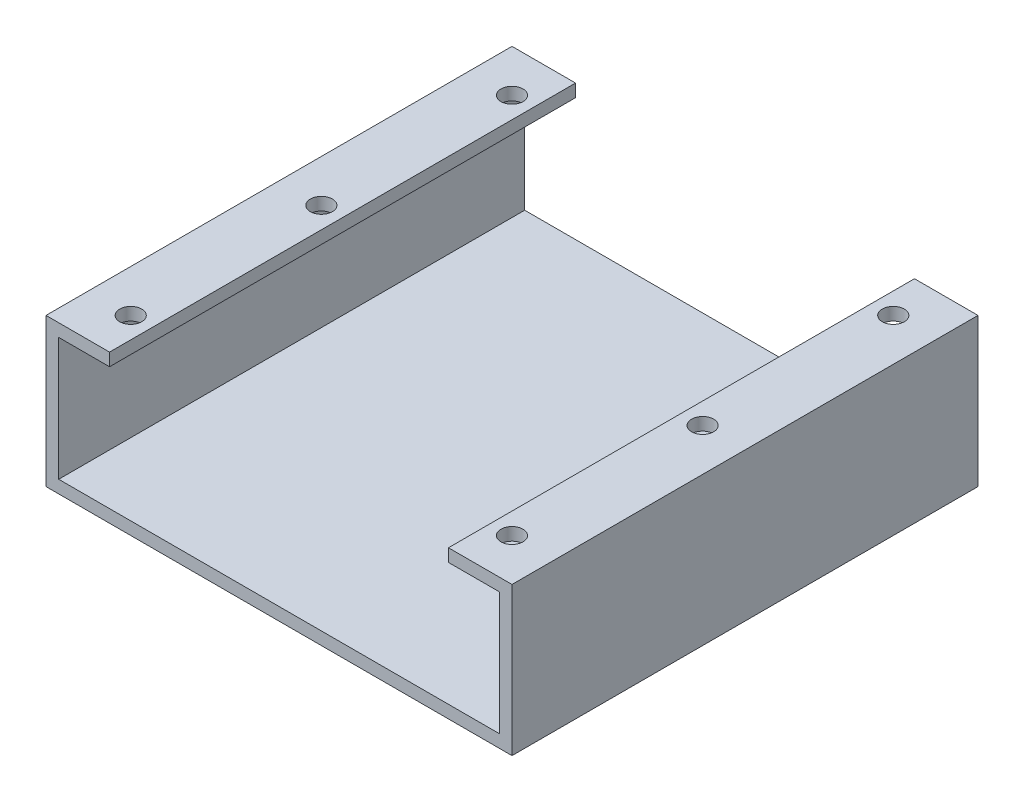
ISO-10303-21;
HEADER;
FILE_DESCRIPTION(('STEP AP214'),'2;1');
FILE_NAME('part.step','',(''),(''),'','','');
FILE_SCHEMA(('AUTOMOTIVE_DESIGN { 1 0 10303 214 1 1 1 1 }'));
ENDSEC;
DATA;
#1=APPLICATION_CONTEXT('core data for automotive mechanical design processes');
#2=APPLICATION_PROTOCOL_DEFINITION('international standard','automotive_design',2000,#1);
#3=PRODUCT_CONTEXT('',#1,'mechanical');
#4=PRODUCT('Part','Part','',(#3));
#5=PRODUCT_RELATED_PRODUCT_CATEGORY('part','',(#4));
#6=PRODUCT_DEFINITION_FORMATION('','',#4);
#7=PRODUCT_DEFINITION_CONTEXT('part definition',#1,'design');
#8=PRODUCT_DEFINITION('design','',#6,#7);
#9=PRODUCT_DEFINITION_SHAPE('','',#8);
#10=(LENGTH_UNIT() NAMED_UNIT(*) SI_UNIT(.MILLI.,.METRE.));
#11=(NAMED_UNIT(*) PLANE_ANGLE_UNIT() SI_UNIT($,.RADIAN.));
#12=(NAMED_UNIT(*) SI_UNIT($,.STERADIAN.) SOLID_ANGLE_UNIT());
#13=UNCERTAINTY_MEASURE_WITH_UNIT(LENGTH_MEASURE(1.E-05),#10,'distance_accuracy_value','');
#14=(GEOMETRIC_REPRESENTATION_CONTEXT(3) GLOBAL_UNCERTAINTY_ASSIGNED_CONTEXT((#13)) GLOBAL_UNIT_ASSIGNED_CONTEXT((#10,
#11,#12)) REPRESENTATION_CONTEXT('',''));
#15=CARTESIAN_POINT('',(0.,0.,0.));
#16=DIRECTION('',(0.,0.,1.));
#17=DIRECTION('',(1.,0.,0.));
#18=AXIS2_PLACEMENT_3D('',#15,#16,#17);
#19=CARTESIAN_POINT('',(0.,0.,110.));
#20=DIRECTION('',(1.,0.,0.));
#21=DIRECTION('',(0.,0.,-1.));
#22=AXIS2_PLACEMENT_3D('',#19,#20,#21);
#23=PLANE('',#22);
#24=DIRECTION('',(0.,-1.,0.));
#25=VECTOR('',#24,1.);
#26=CARTESIAN_POINT('',(0.,0.,0.));
#27=LINE('',#26,#25);
#28=CARTESIAN_POINT('',(0.,35.,0.));
#29=VERTEX_POINT('',#28);
#30=CARTESIAN_POINT('',(0.,0.,0.));
#31=VERTEX_POINT('',#30);
#32=EDGE_CURVE('E155',#29,#31,#27,.T.);
#33=ORIENTED_EDGE('',*,*,#32,.T.);
#34=DIRECTION('',(0.,0.,-1.));
#35=VECTOR('',#34,1.);
#36=CARTESIAN_POINT('',(0.,0.,110.));
#37=LINE('',#36,#35);
#38=CARTESIAN_POINT('',(0.,0.,110.));
#39=VERTEX_POINT('',#38);
#40=EDGE_CURVE('E11',#39,#31,#37,.T.);
#41=ORIENTED_EDGE('',*,*,#40,.F.);
#42=DIRECTION('',(0.,-1.,0.));
#43=VECTOR('',#42,1.);
#44=CARTESIAN_POINT('',(0.,0.,110.));
#45=LINE('',#44,#43);
#46=CARTESIAN_POINT('',(0.,35.,110.));
#47=VERTEX_POINT('',#46);
#48=EDGE_CURVE('E178',#47,#39,#45,.T.);
#49=ORIENTED_EDGE('',*,*,#48,.F.);
#50=DIRECTION('',(0.,0.,-1.));
#51=VECTOR('',#50,1.);
#52=CARTESIAN_POINT('',(0.,35.,110.));
#53=LINE('',#52,#51);
#54=EDGE_CURVE('E151',#47,#29,#53,.T.);
#55=ORIENTED_EDGE('',*,*,#54,.T.);
#56=EDGE_LOOP('',(#33,#41,#49,#55));
#57=FACE_BOUND('',#56,.T.);
#58=ADVANCED_FACE('F35',(#57),#23,.F.);
#59=CARTESIAN_POINT('',(0.,0.,110.));
#60=DIRECTION('',(0.,1.,0.));
#61=DIRECTION('',(0.,0.,1.));
#62=AXIS2_PLACEMENT_3D('',#59,#60,#61);
#63=PLANE('',#62);
#64=DIRECTION('',(1.,0.,0.));
#65=VECTOR('',#64,1.);
#66=CARTESIAN_POINT('',(0.,0.,0.));
#67=LINE('',#66,#65);
#68=CARTESIAN_POINT('',(110.,0.,0.));
#69=VERTEX_POINT('',#68);
#70=EDGE_CURVE('E158',#31,#69,#67,.T.);
#71=ORIENTED_EDGE('',*,*,#70,.T.);
#72=DIRECTION('',(0.,0.,-1.));
#73=VECTOR('',#72,1.);
#74=CARTESIAN_POINT('',(110.,0.,110.));
#75=LINE('',#74,#73);
#76=CARTESIAN_POINT('',(110.,0.,110.));
#77=VERTEX_POINT('',#76);
#78=EDGE_CURVE('E43',#77,#69,#75,.T.);
#79=ORIENTED_EDGE('',*,*,#78,.F.);
#80=DIRECTION('',(1.,0.,0.));
#81=VECTOR('',#80,1.);
#82=CARTESIAN_POINT('',(0.,0.,110.));
#83=LINE('',#82,#81);
#84=EDGE_CURVE('E106',#39,#77,#83,.T.);
#85=ORIENTED_EDGE('',*,*,#84,.F.);
#86=ORIENTED_EDGE('',*,*,#40,.T.);
#87=EDGE_LOOP('',(#71,#79,#85,#86));
#88=FACE_BOUND('',#87,.T.);
#89=ADVANCED_FACE('F259',(#88),#63,.F.);
#90=CARTESIAN_POINT('',(110.,0.,110.));
#91=DIRECTION('',(-1.,0.,0.));
#92=DIRECTION('',(0.,0.,1.));
#93=AXIS2_PLACEMENT_3D('',#90,#91,#92);
#94=PLANE('',#93);
#95=DIRECTION('',(0.,1.,0.));
#96=VECTOR('',#95,1.);
#97=CARTESIAN_POINT('',(110.,0.,0.));
#98=LINE('',#97,#96);
#99=CARTESIAN_POINT('',(110.,35.,0.));
#100=VERTEX_POINT('',#99);
#101=EDGE_CURVE('E161',#69,#100,#98,.T.);
#102=ORIENTED_EDGE('',*,*,#101,.T.);
#103=DIRECTION('',(0.,0.,-1.));
#104=VECTOR('',#103,1.);
#105=CARTESIAN_POINT('',(110.,35.,110.));
#106=LINE('',#105,#104);
#107=CARTESIAN_POINT('',(110.,35.,110.));
#108=VERTEX_POINT('',#107);
#109=EDGE_CURVE('E197',#108,#100,#106,.T.);
#110=ORIENTED_EDGE('',*,*,#109,.F.);
#111=DIRECTION('',(0.,1.,0.));
#112=VECTOR('',#111,1.);
#113=CARTESIAN_POINT('',(110.,0.,110.));
#114=LINE('',#113,#112);
#115=EDGE_CURVE('E205',#77,#108,#114,.T.);
#116=ORIENTED_EDGE('',*,*,#115,.F.);
#117=ORIENTED_EDGE('',*,*,#78,.T.);
#118=EDGE_LOOP('',(#102,#110,#116,#117));
#119=FACE_BOUND('',#118,.T.);
#120=ADVANCED_FACE('F203',(#119),#94,.F.);
#121=CARTESIAN_POINT('',(110.,35.,110.));
#122=DIRECTION('',(0.,-1.,0.));
#123=DIRECTION('',(0.,0.,-1.));
#124=AXIS2_PLACEMENT_3D('',#121,#122,#123);
#125=PLANE('',#124);
#126=CARTESIAN_POINT('',(100.000000000001,35.,100.));
#127=DIRECTION('',(0.,1.,0.));
#128=DIRECTION('',(0.,0.,1.));
#129=AXIS2_PLACEMENT_3D('',#126,#127,#128);
#130=CIRCLE('',#129,2.6);
#131=CARTESIAN_POINT('',(100.000000000001,35.,102.6));
#132=VERTEX_POINT('',#131);
#133=EDGE_CURVE('E324',#132,#132,#130,.T.);
#134=ORIENTED_EDGE('',*,*,#133,.F.);
#135=EDGE_LOOP('',(#134));
#136=FACE_BOUND('',#135,.T.);
#137=CARTESIAN_POINT('',(100.,35.,55.));
#138=DIRECTION('',(0.,1.,0.));
#139=DIRECTION('',(0.,0.,1.));
#140=AXIS2_PLACEMENT_3D('',#137,#138,#139);
#141=CIRCLE('',#140,2.6);
#142=CARTESIAN_POINT('',(100.,35.,57.6));
#143=VERTEX_POINT('',#142);
#144=EDGE_CURVE('E306',#143,#143,#141,.T.);
#145=ORIENTED_EDGE('',*,*,#144,.F.);
#146=EDGE_LOOP('',(#145));
#147=FACE_BOUND('',#146,.T.);
#148=CARTESIAN_POINT('',(100.,35.,10.));
#149=DIRECTION('',(0.,1.,0.));
#150=DIRECTION('',(0.,0.,1.));
#151=AXIS2_PLACEMENT_3D('',#148,#149,#150);
#152=CIRCLE('',#151,2.6);
#153=CARTESIAN_POINT('',(100.,35.,12.6));
#154=VERTEX_POINT('',#153);
#155=EDGE_CURVE('E315',#154,#154,#152,.T.);
#156=ORIENTED_EDGE('',*,*,#155,.F.);
#157=EDGE_LOOP('',(#156));
#158=FACE_BOUND('',#157,.T.);
#159=DIRECTION('',(-1.,0.,0.));
#160=VECTOR('',#159,1.);
#161=CARTESIAN_POINT('',(110.,35.,0.));
#162=LINE('',#161,#160);
#163=CARTESIAN_POINT('',(95.,35.,0.));
#164=VERTEX_POINT('',#163);
#165=EDGE_CURVE('E163',#100,#164,#162,.T.);
#166=ORIENTED_EDGE('',*,*,#165,.T.);
#167=DIRECTION('',(0.,0.,-1.));
#168=VECTOR('',#167,1.);
#169=CARTESIAN_POINT('',(95.,35.,110.));
#170=LINE('',#169,#168);
#171=CARTESIAN_POINT('',(95.,35.,110.));
#172=VERTEX_POINT('',#171);
#173=EDGE_CURVE('E194',#172,#164,#170,.T.);
#174=ORIENTED_EDGE('',*,*,#173,.F.);
#175=DIRECTION('',(-1.,0.,0.));
#176=VECTOR('',#175,1.);
#177=CARTESIAN_POINT('',(110.,35.,110.));
#178=LINE('',#177,#176);
#179=EDGE_CURVE('E223',#108,#172,#178,.T.);
#180=ORIENTED_EDGE('',*,*,#179,.F.);
#181=ORIENTED_EDGE('',*,*,#109,.T.);
#182=EDGE_LOOP('',(#166,#174,#180,#181));
#183=FACE_BOUND('',#182,.T.);
#184=ADVANCED_FACE('F214',(#136,#147,#158,#183),#125,.F.);
#185=CARTESIAN_POINT('',(95.,35.,110.));
#186=DIRECTION('',(1.,0.,0.));
#187=DIRECTION('',(0.,0.,-1.));
#188=AXIS2_PLACEMENT_3D('',#185,#186,#187);
#189=PLANE('',#188);
#190=DIRECTION('',(0.,-1.,0.));
#191=VECTOR('',#190,1.);
#192=CARTESIAN_POINT('',(95.,35.,0.));
#193=LINE('',#192,#191);
#194=CARTESIAN_POINT('',(95.,32.,0.));
#195=VERTEX_POINT('',#194);
#196=EDGE_CURVE('E165',#164,#195,#193,.T.);
#197=ORIENTED_EDGE('',*,*,#196,.T.);
#198=DIRECTION('',(0.,0.,-1.));
#199=VECTOR('',#198,1.);
#200=CARTESIAN_POINT('',(95.,32.,110.));
#201=LINE('',#200,#199);
#202=CARTESIAN_POINT('',(95.,32.,110.));
#203=VERTEX_POINT('',#202);
#204=EDGE_CURVE('E191',#203,#195,#201,.T.);
#205=ORIENTED_EDGE('',*,*,#204,.F.);
#206=DIRECTION('',(0.,-1.,0.));
#207=VECTOR('',#206,1.);
#208=CARTESIAN_POINT('',(95.,35.,110.));
#209=LINE('',#208,#207);
#210=EDGE_CURVE('E220',#172,#203,#209,.T.);
#211=ORIENTED_EDGE('',*,*,#210,.F.);
#212=ORIENTED_EDGE('',*,*,#173,.T.);
#213=EDGE_LOOP('',(#197,#205,#211,#212));
#214=FACE_BOUND('',#213,.T.);
#215=ADVANCED_FACE('F218',(#214),#189,.F.);
#216=CARTESIAN_POINT('',(107.,32.,110.));
#217=DIRECTION('',(0.,1.,0.));
#218=DIRECTION('',(0.,0.,1.));
#219=AXIS2_PLACEMENT_3D('',#216,#217,#218);
#220=PLANE('',#219);
#221=CARTESIAN_POINT('',(100.000000000001,32.,100.));
#222=DIRECTION('',(0.,1.,0.));
#223=DIRECTION('',(0.,0.,1.));
#224=AXIS2_PLACEMENT_3D('',#221,#222,#223);
#225=CIRCLE('',#224,2.6);
#226=CARTESIAN_POINT('',(100.000000000001,32.,102.6));
#227=VERTEX_POINT('',#226);
#228=EDGE_CURVE('E312',#227,#227,#225,.T.);
#229=ORIENTED_EDGE('',*,*,#228,.T.);
#230=EDGE_LOOP('',(#229));
#231=FACE_BOUND('',#230,.T.);
#232=CARTESIAN_POINT('',(100.,32.,55.));
#233=DIRECTION('',(0.,1.,0.));
#234=DIRECTION('',(0.,0.,1.));
#235=AXIS2_PLACEMENT_3D('',#232,#233,#234);
#236=CIRCLE('',#235,2.6);
#237=CARTESIAN_POINT('',(100.,32.,57.6));
#238=VERTEX_POINT('',#237);
#239=EDGE_CURVE('E311',#238,#238,#236,.T.);
#240=ORIENTED_EDGE('',*,*,#239,.T.);
#241=EDGE_LOOP('',(#240));
#242=FACE_BOUND('',#241,.T.);
#243=CARTESIAN_POINT('',(100.,32.,10.));
#244=DIRECTION('',(0.,1.,0.));
#245=DIRECTION('',(0.,0.,1.));
#246=AXIS2_PLACEMENT_3D('',#243,#244,#245);
#247=CIRCLE('',#246,2.6);
#248=CARTESIAN_POINT('',(100.,32.,12.6));
#249=VERTEX_POINT('',#248);
#250=EDGE_CURVE('E303',#249,#249,#247,.T.);
#251=ORIENTED_EDGE('',*,*,#250,.T.);
#252=EDGE_LOOP('',(#251));
#253=FACE_BOUND('',#252,.T.);
#254=DIRECTION('',(1.,0.,0.));
#255=VECTOR('',#254,1.);
#256=CARTESIAN_POINT('',(107.,32.,0.));
#257=LINE('',#256,#255);
#258=CARTESIAN_POINT('',(107.,32.,0.));
#259=VERTEX_POINT('',#258);
#260=EDGE_CURVE('E167',#195,#259,#257,.T.);
#261=ORIENTED_EDGE('',*,*,#260,.T.);
#262=DIRECTION('',(0.,0.,-1.));
#263=VECTOR('',#262,1.);
#264=CARTESIAN_POINT('',(107.,32.,110.));
#265=LINE('',#264,#263);
#266=CARTESIAN_POINT('',(107.,32.,110.));
#267=VERTEX_POINT('',#266);
#268=EDGE_CURVE('E188',#267,#259,#265,.T.);
#269=ORIENTED_EDGE('',*,*,#268,.F.);
#270=DIRECTION('',(1.,0.,0.));
#271=VECTOR('',#270,1.);
#272=CARTESIAN_POINT('',(107.,32.,110.));
#273=LINE('',#272,#271);
#274=EDGE_CURVE('E222',#203,#267,#273,.T.);
#275=ORIENTED_EDGE('',*,*,#274,.F.);
#276=ORIENTED_EDGE('',*,*,#204,.T.);
#277=EDGE_LOOP('',(#261,#269,#275,#276));
#278=FACE_BOUND('',#277,.T.);
#279=ADVANCED_FACE('F273',(#231,#242,#253,#278),#220,.F.);
#280=CARTESIAN_POINT('',(107.,3.,110.));
#281=DIRECTION('',(1.,0.,0.));
#282=DIRECTION('',(0.,0.,-1.));
#283=AXIS2_PLACEMENT_3D('',#280,#281,#282);
#284=PLANE('',#283);
#285=DIRECTION('',(0.,-1.,0.));
#286=VECTOR('',#285,1.);
#287=CARTESIAN_POINT('',(107.,3.,0.));
#288=LINE('',#287,#286);
#289=CARTESIAN_POINT('',(107.,3.,0.));
#290=VERTEX_POINT('',#289);
#291=EDGE_CURVE('E169',#259,#290,#288,.T.);
#292=ORIENTED_EDGE('',*,*,#291,.T.);
#293=DIRECTION('',(0.,0.,-1.));
#294=VECTOR('',#293,1.);
#295=CARTESIAN_POINT('',(107.,3.,110.));
#296=LINE('',#295,#294);
#297=CARTESIAN_POINT('',(107.,3.,110.));
#298=VERTEX_POINT('',#297);
#299=EDGE_CURVE('E185',#298,#290,#296,.T.);
#300=ORIENTED_EDGE('',*,*,#299,.F.);
#301=DIRECTION('',(0.,-1.,0.));
#302=VECTOR('',#301,1.);
#303=CARTESIAN_POINT('',(107.,3.,110.));
#304=LINE('',#303,#302);
#305=EDGE_CURVE('E225',#267,#298,#304,.T.);
#306=ORIENTED_EDGE('',*,*,#305,.F.);
#307=ORIENTED_EDGE('',*,*,#268,.T.);
#308=EDGE_LOOP('',(#292,#300,#306,#307));
#309=FACE_BOUND('',#308,.T.);
#310=ADVANCED_FACE('F276',(#309),#284,.F.);
#311=CARTESIAN_POINT('',(3.,3.,110.));
#312=DIRECTION('',(0.,-1.,0.));
#313=DIRECTION('',(0.,0.,-1.));
#314=AXIS2_PLACEMENT_3D('',#311,#312,#313);
#315=PLANE('',#314);
#316=DIRECTION('',(-1.,0.,0.));
#317=VECTOR('',#316,1.);
#318=CARTESIAN_POINT('',(3.,3.,0.));
#319=LINE('',#318,#317);
#320=CARTESIAN_POINT('',(3.,3.,0.));
#321=VERTEX_POINT('',#320);
#322=EDGE_CURVE('E171',#290,#321,#319,.T.);
#323=ORIENTED_EDGE('',*,*,#322,.T.);
#324=DIRECTION('',(0.,0.,-1.));
#325=VECTOR('',#324,1.);
#326=CARTESIAN_POINT('',(3.,3.,110.));
#327=LINE('',#326,#325);
#328=CARTESIAN_POINT('',(3.,3.,110.));
#329=VERTEX_POINT('',#328);
#330=EDGE_CURVE('E182',#329,#321,#327,.T.);
#331=ORIENTED_EDGE('',*,*,#330,.F.);
#332=DIRECTION('',(-1.,0.,0.));
#333=VECTOR('',#332,1.);
#334=CARTESIAN_POINT('',(3.,3.,110.));
#335=LINE('',#334,#333);
#336=EDGE_CURVE('E231',#298,#329,#335,.T.);
#337=ORIENTED_EDGE('',*,*,#336,.F.);
#338=ORIENTED_EDGE('',*,*,#299,.T.);
#339=EDGE_LOOP('',(#323,#331,#337,#338));
#340=FACE_BOUND('',#339,.T.);
#341=ADVANCED_FACE('F237',(#340),#315,.F.);
#342=CARTESIAN_POINT('',(3.,32.,110.));
#343=DIRECTION('',(-1.,0.,0.));
#344=DIRECTION('',(0.,-1.,0.));
#345=AXIS2_PLACEMENT_3D('',#342,#343,#344);
#346=PLANE('',#345);
#347=DIRECTION('',(0.,1.,0.));
#348=VECTOR('',#347,1.);
#349=CARTESIAN_POINT('',(3.,32.,0.));
#350=LINE('',#349,#348);
#351=CARTESIAN_POINT('',(3.,32.,0.));
#352=VERTEX_POINT('',#351);
#353=EDGE_CURVE('E173',#321,#352,#350,.T.);
#354=ORIENTED_EDGE('',*,*,#353,.T.);
#355=DIRECTION('',(0.,0.,-1.));
#356=VECTOR('',#355,1.);
#357=CARTESIAN_POINT('',(3.,32.,110.));
#358=LINE('',#357,#356);
#359=CARTESIAN_POINT('',(3.,32.,110.));
#360=VERTEX_POINT('',#359);
#361=EDGE_CURVE('E146',#360,#352,#358,.T.);
#362=ORIENTED_EDGE('',*,*,#361,.F.);
#363=DIRECTION('',(0.,1.,0.));
#364=VECTOR('',#363,1.);
#365=CARTESIAN_POINT('',(3.,32.,110.));
#366=LINE('',#365,#364);
#367=EDGE_CURVE('E137',#329,#360,#366,.T.);
#368=ORIENTED_EDGE('',*,*,#367,.F.);
#369=ORIENTED_EDGE('',*,*,#330,.T.);
#370=EDGE_LOOP('',(#354,#362,#368,#369));
#371=FACE_BOUND('',#370,.T.);
#372=ADVANCED_FACE('F241',(#371),#346,.F.);
#373=CARTESIAN_POINT('',(15.,32.,110.));
#374=DIRECTION('',(0.,1.,0.));
#375=DIRECTION('',(0.,0.,1.));
#376=AXIS2_PLACEMENT_3D('',#373,#374,#375);
#377=PLANE('',#376);
#378=CARTESIAN_POINT('',(10.0000000000005,32.,55.));
#379=DIRECTION('',(0.,1.,0.));
#380=DIRECTION('',(0.,0.,1.));
#381=AXIS2_PLACEMENT_3D('',#378,#379,#380);
#382=CIRCLE('',#381,2.6);
#383=CARTESIAN_POINT('',(10.0000000000005,32.,57.6));
#384=VERTEX_POINT('',#383);
#385=EDGE_CURVE('E292',#384,#384,#382,.T.);
#386=ORIENTED_EDGE('',*,*,#385,.T.);
#387=EDGE_LOOP('',(#386));
#388=FACE_BOUND('',#387,.T.);
#389=CARTESIAN_POINT('',(10.0000000000009,32.,100.));
#390=DIRECTION('',(0.,1.,0.));
#391=DIRECTION('',(0.,0.,1.));
#392=AXIS2_PLACEMENT_3D('',#389,#390,#391);
#393=CIRCLE('',#392,2.6);
#394=CARTESIAN_POINT('',(10.0000000000009,32.,102.6));
#395=VERTEX_POINT('',#394);
#396=EDGE_CURVE('E296',#395,#395,#393,.T.);
#397=ORIENTED_EDGE('',*,*,#396,.T.);
#398=EDGE_LOOP('',(#397));
#399=FACE_BOUND('',#398,.T.);
#400=CARTESIAN_POINT('',(10.,32.,10.));
#401=DIRECTION('',(0.,1.,0.));
#402=DIRECTION('',(0.,0.,1.));
#403=AXIS2_PLACEMENT_3D('',#400,#401,#402);
#404=CIRCLE('',#403,2.6);
#405=CARTESIAN_POINT('',(10.,32.,12.6));
#406=VERTEX_POINT('',#405);
#407=EDGE_CURVE('E159',#406,#406,#404,.T.);
#408=ORIENTED_EDGE('',*,*,#407,.T.);
#409=EDGE_LOOP('',(#408));
#410=FACE_BOUND('',#409,.T.);
#411=DIRECTION('',(1.,0.,0.));
#412=VECTOR('',#411,1.);
#413=CARTESIAN_POINT('',(15.,32.,0.));
#414=LINE('',#413,#412);
#415=CARTESIAN_POINT('',(15.,32.,0.));
#416=VERTEX_POINT('',#415);
#417=EDGE_CURVE('E145',#352,#416,#414,.T.);
#418=ORIENTED_EDGE('',*,*,#417,.T.);
#419=DIRECTION('',(0.,0.,-1.));
#420=VECTOR('',#419,1.);
#421=CARTESIAN_POINT('',(15.,32.,110.));
#422=LINE('',#421,#420);
#423=CARTESIAN_POINT('',(15.,32.,110.));
#424=VERTEX_POINT('',#423);
#425=EDGE_CURVE('E142',#424,#416,#422,.T.);
#426=ORIENTED_EDGE('',*,*,#425,.F.);
#427=DIRECTION('',(1.,0.,0.));
#428=VECTOR('',#427,1.);
#429=CARTESIAN_POINT('',(15.,32.,110.));
#430=LINE('',#429,#428);
#431=EDGE_CURVE('E131',#360,#424,#430,.T.);
#432=ORIENTED_EDGE('',*,*,#431,.F.);
#433=ORIENTED_EDGE('',*,*,#361,.T.);
#434=EDGE_LOOP('',(#418,#426,#432,#433));
#435=FACE_BOUND('',#434,.T.);
#436=ADVANCED_FACE('F143',(#388,#399,#410,#435),#377,.F.);
#437=CARTESIAN_POINT('',(15.,35.,110.));
#438=DIRECTION('',(-1.,0.,0.));
#439=DIRECTION('',(0.,-1.,0.));
#440=AXIS2_PLACEMENT_3D('',#437,#438,#439);
#441=PLANE('',#440);
#442=DIRECTION('',(0.,1.,0.));
#443=VECTOR('',#442,1.);
#444=CARTESIAN_POINT('',(15.,35.,0.));
#445=LINE('',#444,#443);
#446=CARTESIAN_POINT('',(15.,35.,0.));
#447=VERTEX_POINT('',#446);
#448=EDGE_CURVE('E92',#416,#447,#445,.T.);
#449=ORIENTED_EDGE('',*,*,#448,.T.);
#450=DIRECTION('',(0.,0.,-1.));
#451=VECTOR('',#450,1.);
#452=CARTESIAN_POINT('',(15.,35.,110.));
#453=LINE('',#452,#451);
#454=CARTESIAN_POINT('',(15.,35.,110.));
#455=VERTEX_POINT('',#454);
#456=EDGE_CURVE('E147',#455,#447,#453,.T.);
#457=ORIENTED_EDGE('',*,*,#456,.F.);
#458=DIRECTION('',(0.,1.,0.));
#459=VECTOR('',#458,1.);
#460=CARTESIAN_POINT('',(15.,35.,110.));
#461=LINE('',#460,#459);
#462=EDGE_CURVE('E135',#424,#455,#461,.T.);
#463=ORIENTED_EDGE('',*,*,#462,.F.);
#464=ORIENTED_EDGE('',*,*,#425,.T.);
#465=EDGE_LOOP('',(#449,#457,#463,#464));
#466=FACE_BOUND('',#465,.T.);
#467=ADVANCED_FACE('F149',(#466),#441,.F.);
#468=CARTESIAN_POINT('',(0.,35.,110.));
#469=DIRECTION('',(0.,-1.,0.));
#470=DIRECTION('',(0.,0.,-1.));
#471=AXIS2_PLACEMENT_3D('',#468,#469,#470);
#472=PLANE('',#471);
#473=CARTESIAN_POINT('',(10.0000000000005,35.,55.));
#474=DIRECTION('',(0.,1.,0.));
#475=DIRECTION('',(0.,0.,1.));
#476=AXIS2_PLACEMENT_3D('',#473,#474,#475);
#477=CIRCLE('',#476,2.6);
#478=CARTESIAN_POINT('',(10.0000000000005,35.,57.6));
#479=VERTEX_POINT('',#478);
#480=EDGE_CURVE('E320',#479,#479,#477,.T.);
#481=ORIENTED_EDGE('',*,*,#480,.F.);
#482=EDGE_LOOP('',(#481));
#483=FACE_BOUND('',#482,.T.);
#484=CARTESIAN_POINT('',(10.0000000000009,35.,100.));
#485=DIRECTION('',(0.,1.,0.));
#486=DIRECTION('',(0.,0.,1.));
#487=AXIS2_PLACEMENT_3D('',#484,#485,#486);
#488=CIRCLE('',#487,2.6);
#489=CARTESIAN_POINT('',(10.0000000000009,35.,102.6));
#490=VERTEX_POINT('',#489);
#491=EDGE_CURVE('E329',#490,#490,#488,.T.);
#492=ORIENTED_EDGE('',*,*,#491,.F.);
#493=EDGE_LOOP('',(#492));
#494=FACE_BOUND('',#493,.T.);
#495=CARTESIAN_POINT('',(10.,35.,10.));
#496=DIRECTION('',(0.,1.,0.));
#497=DIRECTION('',(0.,0.,1.));
#498=AXIS2_PLACEMENT_3D('',#495,#496,#497);
#499=CIRCLE('',#498,2.6);
#500=CARTESIAN_POINT('',(10.,35.,12.6));
#501=VERTEX_POINT('',#500);
#502=EDGE_CURVE('E300',#501,#501,#499,.T.);
#503=ORIENTED_EDGE('',*,*,#502,.F.);
#504=EDGE_LOOP('',(#503));
#505=FACE_BOUND('',#504,.T.);
#506=DIRECTION('',(-1.,0.,0.));
#507=VECTOR('',#506,1.);
#508=CARTESIAN_POINT('',(0.,35.,0.));
#509=LINE('',#508,#507);
#510=EDGE_CURVE('E98',#447,#29,#509,.T.);
#511=ORIENTED_EDGE('',*,*,#510,.T.);
#512=ORIENTED_EDGE('',*,*,#54,.F.);
#513=DIRECTION('',(-1.,0.,0.));
#514=VECTOR('',#513,1.);
#515=CARTESIAN_POINT('',(0.,35.,110.));
#516=LINE('',#515,#514);
#517=EDGE_CURVE('E51',#455,#47,#516,.T.);
#518=ORIENTED_EDGE('',*,*,#517,.F.);
#519=ORIENTED_EDGE('',*,*,#456,.T.);
#520=EDGE_LOOP('',(#511,#512,#518,#519));
#521=FACE_BOUND('',#520,.T.);
#522=ADVANCED_FACE('F245',(#483,#494,#505,#521),#472,.F.);
#523=CARTESIAN_POINT('',(0.,0.,110.));
#524=DIRECTION('',(0.,0.,-1.));
#525=DIRECTION('',(-1.,0.,0.));
#526=AXIS2_PLACEMENT_3D('',#523,#524,#525);
#527=PLANE('',#526);
#528=ORIENTED_EDGE('',*,*,#48,.T.);
#529=ORIENTED_EDGE('',*,*,#84,.T.);
#530=ORIENTED_EDGE('',*,*,#115,.T.);
#531=ORIENTED_EDGE('',*,*,#179,.T.);
#532=ORIENTED_EDGE('',*,*,#210,.T.);
#533=ORIENTED_EDGE('',*,*,#274,.T.);
#534=ORIENTED_EDGE('',*,*,#305,.T.);
#535=ORIENTED_EDGE('',*,*,#336,.T.);
#536=ORIENTED_EDGE('',*,*,#367,.T.);
#537=ORIENTED_EDGE('',*,*,#431,.T.);
#538=ORIENTED_EDGE('',*,*,#462,.T.);
#539=ORIENTED_EDGE('',*,*,#517,.T.);
#540=EDGE_LOOP('',(#528,#529,#530,#531,#532,#533,#534,#535,#536,#537,#538,#539));
#541=FACE_BOUND('',#540,.T.);
#542=ADVANCED_FACE('F133',(#541),#527,.F.);
#543=CARTESIAN_POINT('',(0.,0.,0.));
#544=DIRECTION('',(0.,0.,-1.));
#545=DIRECTION('',(-1.,0.,0.));
#546=AXIS2_PLACEMENT_3D('',#543,#544,#545);
#547=PLANE('',#546);
#548=ORIENTED_EDGE('',*,*,#32,.F.);
#549=ORIENTED_EDGE('',*,*,#510,.F.);
#550=ORIENTED_EDGE('',*,*,#448,.F.);
#551=ORIENTED_EDGE('',*,*,#417,.F.);
#552=ORIENTED_EDGE('',*,*,#353,.F.);
#553=ORIENTED_EDGE('',*,*,#322,.F.);
#554=ORIENTED_EDGE('',*,*,#291,.F.);
#555=ORIENTED_EDGE('',*,*,#260,.F.);
#556=ORIENTED_EDGE('',*,*,#196,.F.);
#557=ORIENTED_EDGE('',*,*,#165,.F.);
#558=ORIENTED_EDGE('',*,*,#101,.F.);
#559=ORIENTED_EDGE('',*,*,#70,.F.);
#560=EDGE_LOOP('',(#548,#549,#550,#551,#552,#553,#554,#555,#556,#557,#558,#559));
#561=FACE_BOUND('',#560,.T.);
#562=ADVANCED_FACE('F209',(#561),#547,.T.);
#563=CARTESIAN_POINT('',(10.,32.,10.));
#564=DIRECTION('',(0.,1.,0.));
#565=DIRECTION('',(0.,0.,1.));
#566=AXIS2_PLACEMENT_3D('',#563,#564,#565);
#567=CYLINDRICAL_SURFACE('',#566,2.6);
#568=ORIENTED_EDGE('',*,*,#407,.F.);
#569=EDGE_LOOP('',(#568));
#570=FACE_BOUND('',#569,.T.);
#571=ORIENTED_EDGE('',*,*,#502,.T.);
#572=EDGE_LOOP('',(#571));
#573=FACE_BOUND('',#572,.T.);
#574=ADVANCED_FACE('F338',(#570,#573),#567,.F.);
#575=CARTESIAN_POINT('',(10.0000000000009,32.,100.));
#576=DIRECTION('',(0.,1.,0.));
#577=DIRECTION('',(0.,0.,1.));
#578=AXIS2_PLACEMENT_3D('',#575,#576,#577);
#579=CYLINDRICAL_SURFACE('',#578,2.6);
#580=ORIENTED_EDGE('',*,*,#396,.F.);
#581=EDGE_LOOP('',(#580));
#582=FACE_BOUND('',#581,.T.);
#583=ORIENTED_EDGE('',*,*,#491,.T.);
#584=EDGE_LOOP('',(#583));
#585=FACE_BOUND('',#584,.T.);
#586=ADVANCED_FACE('F334',(#582,#585),#579,.F.);
#587=CARTESIAN_POINT('',(10.0000000000005,32.,55.));
#588=DIRECTION('',(0.,1.,0.));
#589=DIRECTION('',(0.,0.,1.));
#590=AXIS2_PLACEMENT_3D('',#587,#588,#589);
#591=CYLINDRICAL_SURFACE('',#590,2.6);
#592=ORIENTED_EDGE('',*,*,#385,.F.);
#593=EDGE_LOOP('',(#592));
#594=FACE_BOUND('',#593,.T.);
#595=ORIENTED_EDGE('',*,*,#480,.T.);
#596=EDGE_LOOP('',(#595));
#597=FACE_BOUND('',#596,.T.);
#598=ADVANCED_FACE('F345',(#594,#597),#591,.F.);
#599=CARTESIAN_POINT('',(100.,32.,10.));
#600=DIRECTION('',(0.,1.,0.));
#601=DIRECTION('',(0.,0.,1.));
#602=AXIS2_PLACEMENT_3D('',#599,#600,#601);
#603=CYLINDRICAL_SURFACE('',#602,2.6);
#604=ORIENTED_EDGE('',*,*,#250,.F.);
#605=EDGE_LOOP('',(#604));
#606=FACE_BOUND('',#605,.T.);
#607=ORIENTED_EDGE('',*,*,#155,.T.);
#608=EDGE_LOOP('',(#607));
#609=FACE_BOUND('',#608,.T.);
#610=ADVANCED_FACE('F353',(#606,#609),#603,.F.);
#611=CARTESIAN_POINT('',(100.,32.,55.));
#612=DIRECTION('',(0.,1.,0.));
#613=DIRECTION('',(0.,0.,1.));
#614=AXIS2_PLACEMENT_3D('',#611,#612,#613);
#615=CYLINDRICAL_SURFACE('',#614,2.6);
#616=ORIENTED_EDGE('',*,*,#239,.F.);
#617=EDGE_LOOP('',(#616));
#618=FACE_BOUND('',#617,.T.);
#619=ORIENTED_EDGE('',*,*,#144,.T.);
#620=EDGE_LOOP('',(#619));
#621=FACE_BOUND('',#620,.T.);
#622=ADVANCED_FACE('F349',(#618,#621),#615,.F.);
#623=CARTESIAN_POINT('',(100.000000000001,32.,100.));
#624=DIRECTION('',(0.,1.,0.));
#625=DIRECTION('',(0.,0.,1.));
#626=AXIS2_PLACEMENT_3D('',#623,#624,#625);
#627=CYLINDRICAL_SURFACE('',#626,2.6);
#628=ORIENTED_EDGE('',*,*,#228,.F.);
#629=EDGE_LOOP('',(#628));
#630=FACE_BOUND('',#629,.T.);
#631=ORIENTED_EDGE('',*,*,#133,.T.);
#632=EDGE_LOOP('',(#631));
#633=FACE_BOUND('',#632,.T.);
#634=ADVANCED_FACE('F352',(#630,#633),#627,.F.);
#635=CLOSED_SHELL('',(#58,#89,#120,#184,#215,#279,#310,#341,#372,#436,#467,#522,#542,#562,#574,
#586,#598,#610,#622,#634));
#636=MANIFOLD_SOLID_BREP('B2',#635);
#637=ADVANCED_BREP_SHAPE_REPRESENTATION('',(#18,#636),#14);
#638=SHAPE_DEFINITION_REPRESENTATION(#9,#637);
ENDSEC;
END-ISO-10303-21;
